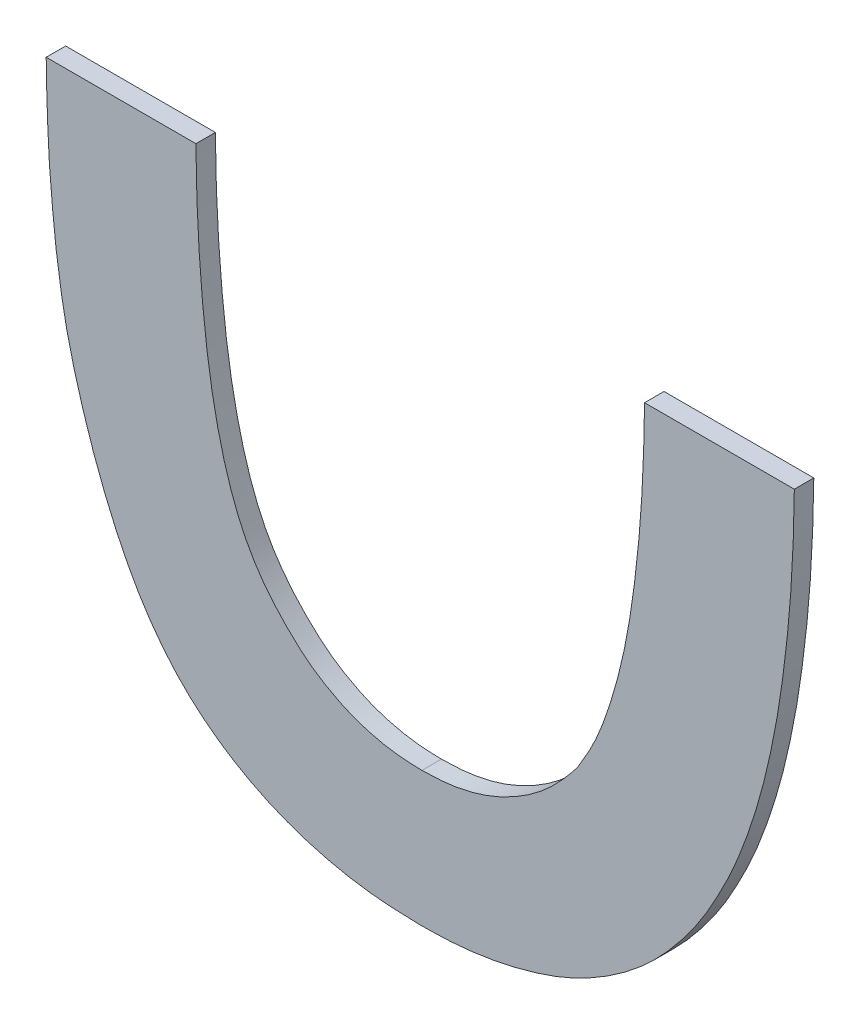
ISO-10303-21;
HEADER;
FILE_DESCRIPTION(('STEP AP214'),'2;1');
FILE_NAME('part.step','',(''),(''),'','','');
FILE_SCHEMA(('AUTOMOTIVE_DESIGN { 1 0 10303 214 1 1 1 1 }'));
ENDSEC;
DATA;
#1=APPLICATION_CONTEXT('core data for automotive mechanical design processes');
#2=APPLICATION_PROTOCOL_DEFINITION('international standard','automotive_design',2000,#1);
#3=PRODUCT_CONTEXT('',#1,'mechanical');
#4=PRODUCT('Part','Part','',(#3));
#5=PRODUCT_RELATED_PRODUCT_CATEGORY('part','',(#4));
#6=PRODUCT_DEFINITION_FORMATION('','',#4);
#7=PRODUCT_DEFINITION_CONTEXT('part definition',#1,'design');
#8=PRODUCT_DEFINITION('design','',#6,#7);
#9=PRODUCT_DEFINITION_SHAPE('','',#8);
#10=(LENGTH_UNIT() NAMED_UNIT(*) SI_UNIT(.MILLI.,.METRE.));
#11=(NAMED_UNIT(*) PLANE_ANGLE_UNIT() SI_UNIT($,.RADIAN.));
#12=(NAMED_UNIT(*) SI_UNIT($,.STERADIAN.) SOLID_ANGLE_UNIT());
#13=UNCERTAINTY_MEASURE_WITH_UNIT(LENGTH_MEASURE(1.E-05),#10,'distance_accuracy_value','');
#14=(GEOMETRIC_REPRESENTATION_CONTEXT(3) GLOBAL_UNCERTAINTY_ASSIGNED_CONTEXT((#13)) GLOBAL_UNIT_ASSIGNED_CONTEXT((#10,
#11,#12)) REPRESENTATION_CONTEXT('',''));
#15=CARTESIAN_POINT('',(0.,0.,0.));
#16=DIRECTION('',(0.,0.,1.));
#17=DIRECTION('',(1.,0.,0.));
#18=AXIS2_PLACEMENT_3D('',#15,#16,#17);
#19=CARTESIAN_POINT('',(0.0420673076912768,-11.5384615384615,0.5));
#20=CARTESIAN_POINT('',(0.240786414309637,-11.5333009100515,0.5));
#21=CARTESIAN_POINT('',(0.632635028196704,-11.5231248121228,0.5));
#22=CARTESIAN_POINT('',(1.20591159328327,-11.4241929709831,0.5));
#23=CARTESIAN_POINT('',(1.75167258286011,-11.2626905300285,0.5));
#24=CARTESIAN_POINT('',(2.26628595280769,-11.0297186532651,0.5));
#25=CARTESIAN_POINT('',(2.75484553812026,-10.7406941453217,0.5));
#26=CARTESIAN_POINT('',(3.21794418441694,-10.3891534082194,0.5));
#27=CARTESIAN_POINT('',(3.6444786071224,-9.96427856158394,0.5));
#28=CARTESIAN_POINT('',(3.90117934517971,-9.64595735773427,0.5));
#29=CARTESIAN_POINT('',(4.03245192307589,-9.48317307692307,0.5));
#30=B_SPLINE_CURVE_WITH_KNOTS('',3,(#19,#20,#21,#22,#23,#24,#25,#26,#27,#28,#29),.UNSPECIFIED.,
.F.,.F.,(4,1,1,1,1,1,1,1,4),(0.,0.127682869136432,0.251774256334202,0.372806201070959,
0.492736455392635,0.61401490129053,0.737160062335526,0.865587935381845,1.),.UNSPECIFIED.);
#31=DIRECTION('',(0.,0.,1.));
#32=VECTOR('',#31,1.);
#33=SURFACE_OF_LINEAR_EXTRUSION('',#30,#32);
#34=CARTESIAN_POINT('',(0.0420673076912768,-11.5384615384615,1.));
#35=CARTESIAN_POINT('',(0.240786414309637,-11.5333009100515,1.));
#36=CARTESIAN_POINT('',(0.632635028196704,-11.5231248121228,1.));
#37=CARTESIAN_POINT('',(1.20591159328327,-11.4241929709831,1.));
#38=CARTESIAN_POINT('',(1.75167258286011,-11.2626905300285,1.));
#39=CARTESIAN_POINT('',(2.26628595280769,-11.0297186532651,1.));
#40=CARTESIAN_POINT('',(2.75484553812026,-10.7406941453217,1.));
#41=CARTESIAN_POINT('',(3.21794418441694,-10.3891534082194,1.));
#42=CARTESIAN_POINT('',(3.6444786071224,-9.96427856158394,1.));
#43=CARTESIAN_POINT('',(3.90117934517971,-9.64595735773427,1.));
#44=CARTESIAN_POINT('',(4.03245192307589,-9.48317307692307,1.));
#45=B_SPLINE_CURVE_WITH_KNOTS('',3,(#34,#35,#36,#37,#38,#39,#40,#41,#42,#43,#44),.UNSPECIFIED.,
.F.,.F.,(4,1,1,1,1,1,1,1,4),(0.,0.127682869136432,0.251774256334202,0.372806201070959,
0.492736455392635,0.61401490129053,0.737160062335526,0.865587935381845,1.),.UNSPECIFIED.);
#46=CARTESIAN_POINT('',(0.0420673076912768,-11.5384615384615,1.));
#47=VERTEX_POINT('',#46);
#48=CARTESIAN_POINT('',(4.03245192307589,-9.48317307692307,1.));
#49=VERTEX_POINT('',#48);
#50=EDGE_CURVE('E151',#47,#49,#45,.T.);
#51=ORIENTED_EDGE('',*,*,#50,.T.);
#52=DIRECTION('',(0.,0.,1.));
#53=VECTOR('',#52,1.);
#54=CARTESIAN_POINT('',(4.03245192307589,-9.48317307692307,0.5));
#55=LINE('',#54,#53);
#56=CARTESIAN_POINT('',(4.03245192307589,-9.48317307692307,0.5));
#57=VERTEX_POINT('',#56);
#58=EDGE_CURVE('E116',#57,#49,#55,.T.);
#59=ORIENTED_EDGE('',*,*,#58,.F.);
#60=CARTESIAN_POINT('',(0.0420673076912768,-11.5384615384615,0.5));
#61=VERTEX_POINT('',#60);
#62=EDGE_CURVE('E154',#61,#57,#30,.T.);
#63=ORIENTED_EDGE('',*,*,#62,.F.);
#64=DIRECTION('',(0.,0.,1.));
#65=VECTOR('',#64,1.);
#66=CARTESIAN_POINT('',(0.0420673076912768,-11.5384615384615,0.5));
#67=LINE('',#66,#65);
#68=EDGE_CURVE('E122',#61,#47,#67,.T.);
#69=ORIENTED_EDGE('',*,*,#68,.T.);
#70=EDGE_LOOP('',(#51,#59,#63,#69));
#71=FACE_BOUND('',#70,.T.);
#72=ADVANCED_FACE('F39',(#71),#33,.F.);
#73=CARTESIAN_POINT('',(4.03245192307589,-9.48317307692307,0.5));
#74=CARTESIAN_POINT('',(4.1754080165598,-9.24417651933019,0.5));
#75=CARTESIAN_POINT('',(4.47730118684764,-8.7394661099924,0.5));
#76=CARTESIAN_POINT('',(4.81497627307182,-7.86223141434757,0.5));
#77=CARTESIAN_POINT('',(5.11442681079824,-6.85797061951387,0.5));
#78=CARTESIAN_POINT('',(5.3576397504729,-5.71429541304869,0.5));
#79=CARTESIAN_POINT('',(5.53760641636854,-4.43277644319568,0.5));
#80=CARTESIAN_POINT('',(5.67698959518765,-3.01545753498198,0.5));
#81=CARTESIAN_POINT('',(5.75009426710679,-1.45709346637208,0.5));
#82=CARTESIAN_POINT('',(5.76267594113006,-0.372661861328687,0.5));
#83=CARTESIAN_POINT('',(5.76923076922974,0.192307692307695,0.5));
#84=B_SPLINE_CURVE_WITH_KNOTS('',3,(#73,#74,#75,#76,#77,#78,#79,#80,#81,#82,#83),.UNSPECIFIED.,
.F.,.F.,(4,1,1,1,1,1,1,1,4),(0.,0.0838887288335159,0.177155332674352,0.282515708589513,
0.399993515725222,0.529487353690131,0.672799776764538,0.829534510787643,1.),.UNSPECIFIED.);
#85=DIRECTION('',(0.,0.,1.));
#86=VECTOR('',#85,1.);
#87=SURFACE_OF_LINEAR_EXTRUSION('',#84,#86);
#88=CARTESIAN_POINT('',(4.03245192307589,-9.48317307692307,1.));
#89=CARTESIAN_POINT('',(4.1754080165598,-9.24417651933019,1.));
#90=CARTESIAN_POINT('',(4.47730118684764,-8.7394661099924,1.));
#91=CARTESIAN_POINT('',(4.81497627307182,-7.86223141434757,1.));
#92=CARTESIAN_POINT('',(5.11442681079824,-6.85797061951387,1.));
#93=CARTESIAN_POINT('',(5.3576397504729,-5.71429541304869,1.));
#94=CARTESIAN_POINT('',(5.53760641636854,-4.43277644319568,1.));
#95=CARTESIAN_POINT('',(5.67698959518765,-3.01545753498198,1.));
#96=CARTESIAN_POINT('',(5.75009426710679,-1.45709346637208,1.));
#97=CARTESIAN_POINT('',(5.76267594113006,-0.372661861328687,1.));
#98=CARTESIAN_POINT('',(5.76923076922974,0.192307692307695,1.));
#99=B_SPLINE_CURVE_WITH_KNOTS('',3,(#88,#89,#90,#91,#92,#93,#94,#95,#96,#97,#98),.UNSPECIFIED.,
.F.,.F.,(4,1,1,1,1,1,1,1,4),(0.,0.0838887288335159,0.177155332674352,0.282515708589513,
0.399993515725222,0.529487353690131,0.672799776764538,0.829534510787643,1.),.UNSPECIFIED.);
#100=CARTESIAN_POINT('',(5.76049072544374,-0.5,1.));
#101=VERTEX_POINT('',#100);
#102=EDGE_CURVE('E111',#49,#101,#99,.T.);
#103=ORIENTED_EDGE('',*,*,#102,.T.);
#104=DIRECTION('',(0.,0.,1.));
#105=VECTOR('',#104,1.);
#106=CARTESIAN_POINT('',(5.76049072544374,-0.500000000007296,0.5));
#107=LINE('',#106,#105);
#108=CARTESIAN_POINT('',(5.76049072544374,-0.500000000007295,0.5));
#109=VERTEX_POINT('',#108);
#110=EDGE_CURVE('E99',#101,#109,#107,.F.);
#111=ORIENTED_EDGE('',*,*,#110,.T.);
#112=EDGE_CURVE('E159',#57,#109,#84,.T.);
#113=ORIENTED_EDGE('',*,*,#112,.F.);
#114=ORIENTED_EDGE('',*,*,#58,.T.);
#115=EDGE_LOOP('',(#103,#111,#113,#114));
#116=FACE_BOUND('',#115,.T.);
#117=ADVANCED_FACE('F194',(#116),#87,.F.);
#118=CARTESIAN_POINT('',(-5.7692307692318,0.192307692307695,0.5));
#119=CARTESIAN_POINT('',(-5.76558857571219,-0.372698327858928,0.5));
#120=CARTESIAN_POINT('',(-5.75861027075951,-1.45522848107276,0.5));
#121=CARTESIAN_POINT('',(-5.6797410109643,-3.0028294072483,0.5));
#122=CARTESIAN_POINT('',(-5.55614874602414,-4.40251031723917,0.5));
#123=CARTESIAN_POINT('',(-5.3870850512294,-5.65555059461358,0.500000000000001));
#124=CARTESIAN_POINT('',(-5.1624280064753,-6.76062476085278,0.5));
#125=CARTESIAN_POINT('',(-4.8898632567801,-7.71997665316074,0.5));
#126=CARTESIAN_POINT('',(-4.56532616473994,-8.53189519306031,0.5));
#127=CARTESIAN_POINT('',(-4.17863786806905,-9.20350199653105,0.5));
#128=CARTESIAN_POINT('',(-3.74989033760966,-9.75789121259897,0.5));
#129=CARTESIAN_POINT('',(-3.29435705418506,-10.2284050562378,0.5));
#130=CARTESIAN_POINT('',(-2.82085358528759,-10.6407321154234,0.5));
#131=CARTESIAN_POINT('',(-2.30232113639501,-10.9635927045618,0.5));
#132=CARTESIAN_POINT('',(-1.7608033270197,-11.2283849588181,0.5));
#133=CARTESIAN_POINT('',(-1.18469172397509,-11.405645498329,0.5));
#134=CARTESIAN_POINT('',(-0.581425152398743,-11.5194099547976,0.5));
#135=CARTESIAN_POINT('',(-0.168803276968812,-11.5320181268037,0.5));
#136=CARTESIAN_POINT('',(0.0420673076912768,-11.5384615384615,0.5));
#137=B_SPLINE_CURVE_WITH_KNOTS('',3,(#118,#119,#120,#121,#122,#123,#124,#125,#126,#127,#128,
#129,#130,#131,#132,#133,#134,#135,#136),.UNSPECIFIED.,.F.,.F.,(4,1,1,1,1,1,1,1,1,1,1,1,1,1,1,1,
4),(0.,0.115634102699545,0.221550564850914,0.317061488513159,0.403168210156165,
0.480201863351944,0.547672913751764,0.607061943921203,0.658680728530501,0.705753234737995,
0.750119517661033,0.792590568079875,0.833879488992673,0.874775679647928,0.915622513522867,
0.956878849704605,1.),.UNSPECIFIED.);
#138=DIRECTION('',(0.,0.,1.));
#139=VECTOR('',#138,1.);
#140=SURFACE_OF_LINEAR_EXTRUSION('',#137,#139);
#141=CARTESIAN_POINT('',(-5.76387434982146,-0.5,0.5));
#142=VERTEX_POINT('',#141);
#143=EDGE_CURVE('E181',#142,#61,#137,.T.);
#144=ORIENTED_EDGE('',*,*,#143,.F.);
#145=DIRECTION('',(0.,0.,1.));
#146=VECTOR('',#145,1.);
#147=CARTESIAN_POINT('',(-5.76387434982146,-0.5,0.5));
#148=LINE('',#147,#146);
#149=CARTESIAN_POINT('',(-5.76387434982146,-0.49999999999995,1.));
#150=VERTEX_POINT('',#149);
#151=EDGE_CURVE('E11',#142,#150,#148,.T.);
#152=ORIENTED_EDGE('',*,*,#151,.T.);
#153=CARTESIAN_POINT('',(-5.7692307692318,0.192307692307695,1.));
#154=CARTESIAN_POINT('',(-5.76558857571219,-0.372698327858928,1.));
#155=CARTESIAN_POINT('',(-5.75861027075951,-1.45522848107276,1.));
#156=CARTESIAN_POINT('',(-5.6797410109643,-3.0028294072483,1.));
#157=CARTESIAN_POINT('',(-5.55614874602414,-4.40251031723917,1.));
#158=CARTESIAN_POINT('',(-5.3870850512294,-5.65555059461358,1.));
#159=CARTESIAN_POINT('',(-5.1624280064753,-6.76062476085278,1.));
#160=CARTESIAN_POINT('',(-4.8898632567801,-7.71997665316074,1.));
#161=CARTESIAN_POINT('',(-4.56532616473994,-8.53189519306031,1.));
#162=CARTESIAN_POINT('',(-4.17863786806905,-9.20350199653105,1.));
#163=CARTESIAN_POINT('',(-3.74989033760966,-9.75789121259897,1.));
#164=CARTESIAN_POINT('',(-3.29435705418506,-10.2284050562378,1.));
#165=CARTESIAN_POINT('',(-2.82085358528759,-10.6407321154234,1.));
#166=CARTESIAN_POINT('',(-2.30232113639501,-10.9635927045618,1.));
#167=CARTESIAN_POINT('',(-1.7608033270197,-11.2283849588181,1.));
#168=CARTESIAN_POINT('',(-1.18469172397509,-11.405645498329,1.));
#169=CARTESIAN_POINT('',(-0.581425152398743,-11.5194099547976,1.));
#170=CARTESIAN_POINT('',(-0.168803276968812,-11.5320181268037,1.));
#171=CARTESIAN_POINT('',(0.0420673076912768,-11.5384615384615,1.));
#172=B_SPLINE_CURVE_WITH_KNOTS('',3,(#153,#154,#155,#156,#157,#158,#159,#160,#161,#162,#163,
#164,#165,#166,#167,#168,#169,#170,#171),.UNSPECIFIED.,.F.,.F.,(4,1,1,1,1,1,1,1,1,1,1,1,1,1,1,1,
4),(0.,0.115634102699545,0.221550564850914,0.317061488513159,0.403168210156165,
0.480201863351944,0.547672913751764,0.607061943921203,0.658680728530501,0.705753234737995,
0.750119517661033,0.792590568079875,0.833879488992673,0.874775679647928,0.915622513522867,
0.956878849704605,1.),.UNSPECIFIED.);
#173=EDGE_CURVE('E158',#150,#47,#172,.T.);
#174=ORIENTED_EDGE('',*,*,#173,.T.);
#175=ORIENTED_EDGE('',*,*,#68,.F.);
#176=EDGE_LOOP('',(#144,#152,#174,#175));
#177=FACE_BOUND('',#176,.T.);
#178=ADVANCED_FACE('F193',(#177),#140,.F.);
#179=CARTESIAN_POINT('',(9.07665296559267,6.58886102964351,0.5));
#180=DIRECTION('',(0.,0.,1.));
#181=DIRECTION('',(1.,0.,0.));
#182=AXIS2_PLACEMENT_3D('',#179,#180,#181);
#183=PLANE('',#182);
#184=CARTESIAN_POINT('',(-1.0321604682062E-12,-15.,0.5));
#185=CARTESIAN_POINT('',(-0.385328520998497,-14.988850103715,0.5));
#186=CARTESIAN_POINT('',(-1.14232185642434,-14.9669456852291,0.5));
#187=CARTESIAN_POINT('',(-2.24613557420914,-14.7830432928222,0.5));
#188=CARTESIAN_POINT('',(-3.28961869038478,-14.4819568472798,0.5));
#189=CARTESIAN_POINT('',(-4.26485879679997,-14.062945452452,0.5));
#190=CARTESIAN_POINT('',(-5.15901153605289,-13.5261726894685,0.5));
#191=CARTESIAN_POINT('',(-5.96088292762468,-12.8811613353897,0.5));
#192=CARTESIAN_POINT('',(-6.65110570728021,-12.1182972704143,0.5));
#193=CARTESIAN_POINT('',(-7.24331810238721,-11.2531672185744,0.5));
#194=CARTESIAN_POINT('',(-7.75158876574181,-10.2860345346414,0.5));
#195=CARTESIAN_POINT('',(-8.20612493559977,-9.22519326738976,0.5));
#196=CARTESIAN_POINT('',(-8.61369789754082,-8.06638132921851,0.5));
#197=CARTESIAN_POINT('',(-8.91201397491909,-7.03200678136618,0.5));
#198=CARTESIAN_POINT('',(-9.12116211313522,-6.13758870617562,0.5));
#199=CARTESIAN_POINT('',(-9.24849707492484,-5.39850268489454,0.5));
#200=CARTESIAN_POINT('',(-9.36606423862533,-4.60347314741359,0.5));
#201=CARTESIAN_POINT('',(-9.4493974289616,-3.75059601253612,0.5));
#202=CARTESIAN_POINT('',(-9.53419573058855,-2.84385750290076,0.5));
#203=CARTESIAN_POINT('',(-9.57606168643943,-1.87930379855171,0.5));
#204=CARTESIAN_POINT('',(-9.60801158413832,-0.857589898346016,0.5));
#205=CARTESIAN_POINT('',(-9.61288086472932,-0.156281197168638,0.5));
#206=CARTESIAN_POINT('',(-9.61538461538565,0.204326923076927,0.5));
#207=B_SPLINE_CURVE_WITH_KNOTS('',3,(#184,#185,#186,#187,#188,#189,#190,#191,#192,#193,#194,
#195,#196,#197,#198,#199,#200,#201,#202,#203,#204,#205,#206),.UNSPECIFIED.,.F.,.F.,(4,1,1,1,1,1,
1,1,1,1,1,1,1,1,1,1,1,1,1,1,4),(0.,0.0567196362764618,0.111428000548503,0.164271091180386,
0.216334326401902,0.267283152573198,0.317412253072944,0.367322113831877,0.418222231336741,
0.47141170856998,0.527968458610384,0.588058873991604,0.652207488831434,0.686415227024687,
0.723277926551376,0.762621236219799,0.804746430743811,0.849458467539935,0.896719818281156,
0.946894039492556,1.),.UNSPECIFIED.);
#208=CARTESIAN_POINT('',(-1.0321604682062E-12,-15.,0.5));
#209=VERTEX_POINT('',#208);
#210=CARTESIAN_POINT('',(-9.60925002230786,-0.5,0.500000000000143));
#211=VERTEX_POINT('',#210);
#212=EDGE_CURVE('E130',#209,#211,#207,.T.);
#213=ORIENTED_EDGE('',*,*,#212,.T.);
#214=DIRECTION('',(1.,0.,0.));
#215=VECTOR('',#214,1.);
#216=CARTESIAN_POINT('',(9.07665296559267,-0.5,0.500000000000026));
#217=LINE('',#216,#215);
#218=EDGE_CURVE('E103',#211,#142,#217,.T.);
#219=ORIENTED_EDGE('',*,*,#218,.T.);
#220=ORIENTED_EDGE('',*,*,#143,.T.);
#221=ORIENTED_EDGE('',*,*,#62,.T.);
#222=ORIENTED_EDGE('',*,*,#112,.T.);
#223=CARTESIAN_POINT('',(9.6079655425923,-0.5,0.500000000000023));
#224=VERTEX_POINT('',#223);
#225=EDGE_CURVE('E54',#109,#224,#217,.T.);
#226=ORIENTED_EDGE('',*,*,#225,.T.);
#227=CARTESIAN_POINT('',(9.61538461538358,0.204326923076927,0.5));
#228=CARTESIAN_POINT('',(9.61150856420301,-0.224400408885449,0.5));
#229=CARTESIAN_POINT('',(9.6039170121901,-1.06409671017859,0.5));
#230=CARTESIAN_POINT('',(9.55685652563403,-2.29272670654069,0.5));
#231=CARTESIAN_POINT('',(9.47461547561735,-3.45949291643717,0.5));
#232=CARTESIAN_POINT('',(9.35210749707355,-4.56343997614587,0.5));
#233=CARTESIAN_POINT('',(9.20593400687098,-5.60880875241869,0.5));
#234=CARTESIAN_POINT('',(9.01867958059482,-6.59281334855436,0.5));
#235=CARTESIAN_POINT('',(8.80499174694216,-7.51655917025234,0.5));
#236=CARTESIAN_POINT('',(8.55170039414064,-8.37654030282214,0.5));
#237=CARTESIAN_POINT('',(8.26871771224848,-9.18167947361874,0.5));
#238=CARTESIAN_POINT('',(7.95304036268916,-9.93424258658525,0.5));
#239=CARTESIAN_POINT('',(7.59356046872461,-10.6303856047183,0.5));
#240=CARTESIAN_POINT('',(7.22062837798749,-11.286680900075,0.5));
#241=CARTESIAN_POINT('',(6.79632431314302,-11.8779466771417,0.5));
#242=CARTESIAN_POINT('',(6.35044991215261,-12.4256583220102,0.5));
#243=CARTESIAN_POINT('',(5.8694280023987,-12.9203024301643,0.5));
#244=CARTESIAN_POINT('',(5.35119562867232,-13.3594863538908,0.5));
#245=CARTESIAN_POINT('',(4.79977019911976,-13.7472163929278,0.5));
#246=CARTESIAN_POINT('',(4.21688791022913,-14.0837251251013,0.5));
#247=CARTESIAN_POINT('',(3.59834687193225,-14.3703498661873,0.5));
#248=CARTESIAN_POINT('',(2.94240242380412,-14.5949011127614,0.5));
#249=CARTESIAN_POINT('',(2.25543922046263,-14.7756348606693,0.5));
#250=CARTESIAN_POINT('',(1.53473885507364,-14.9092400701844,0.5));
#251=CARTESIAN_POINT('',(0.77901648706274,-14.9878482843182,0.5));
#252=CARTESIAN_POINT('',(0.262605694315263,-14.9959036685529,0.5));
#253=CARTESIAN_POINT('',(-1.0321604682062E-12,-15.,0.5));
#254=B_SPLINE_CURVE_WITH_KNOTS('',3,(#227,#228,#229,#230,#231,#232,#233,#234,#235,#236,#237,
#238,#239,#240,#241,#242,#243,#244,#245,#246,#247,#248,#249,#250,#251,#252,#253),.UNSPECIFIED.,
.F.,.F.,(4,1,1,1,1,1,1,1,1,1,1,1,1,1,1,1,1,1,1,1,1,1,1,1,4),(0.,0.063106207716051,
0.12359848616429,0.180950053279516,0.235230700301158,0.287063170407353,0.336276507045082,
0.382622059981955,0.426568049437359,0.468161059594326,0.508194731945807,0.546568450205374,
0.583435365644369,0.619186438381892,0.653542356066901,0.687321508610388,0.720583215672022,
0.753386953654324,0.786412573060312,0.819527578958376,0.853564420101512,0.888322881312637,
0.924005796431376,0.961355357261267,1.),.UNSPECIFIED.);
#255=EDGE_CURVE('E115',#224,#209,#254,.T.);
#256=ORIENTED_EDGE('',*,*,#255,.T.);
#257=EDGE_LOOP('',(#213,#219,#220,#221,#222,#226,#256));
#258=FACE_BOUND('',#257,.T.);
#259=ADVANCED_FACE('F200',(#258),#183,.F.);
#260=DIRECTION('',(0.,0.,1.));
#261=VECTOR('',#260,1.);
#262=SURFACE_OF_LINEAR_EXTRUSION('',#207,#261);
#263=CARTESIAN_POINT('',(-1.0321604682062E-12,-15.,1.));
#264=CARTESIAN_POINT('',(-0.385328520998497,-14.988850103715,1.));
#265=CARTESIAN_POINT('',(-1.14232185642434,-14.9669456852291,1.));
#266=CARTESIAN_POINT('',(-2.24613557420914,-14.7830432928222,1.));
#267=CARTESIAN_POINT('',(-3.28961869038478,-14.4819568472798,1.));
#268=CARTESIAN_POINT('',(-4.26485879679997,-14.062945452452,1.));
#269=CARTESIAN_POINT('',(-5.15901153605289,-13.5261726894685,1.));
#270=CARTESIAN_POINT('',(-5.96088292762468,-12.8811613353897,1.));
#271=CARTESIAN_POINT('',(-6.65110570728021,-12.1182972704143,1.));
#272=CARTESIAN_POINT('',(-7.24331810238721,-11.2531672185744,1.));
#273=CARTESIAN_POINT('',(-7.75158876574181,-10.2860345346414,1.));
#274=CARTESIAN_POINT('',(-8.20612493559977,-9.22519326738976,1.));
#275=CARTESIAN_POINT('',(-8.61369789754082,-8.06638132921851,1.));
#276=CARTESIAN_POINT('',(-8.91201397491909,-7.03200678136618,1.));
#277=CARTESIAN_POINT('',(-9.12116211313522,-6.13758870617562,1.));
#278=CARTESIAN_POINT('',(-9.24849707492484,-5.39850268489454,1.));
#279=CARTESIAN_POINT('',(-9.36606423862533,-4.60347314741359,1.));
#280=CARTESIAN_POINT('',(-9.4493974289616,-3.75059601253612,1.));
#281=CARTESIAN_POINT('',(-9.53419573058855,-2.84385750290076,1.));
#282=CARTESIAN_POINT('',(-9.57606168643943,-1.87930379855171,1.));
#283=CARTESIAN_POINT('',(-9.60801158413832,-0.857589898346016,1.));
#284=CARTESIAN_POINT('',(-9.61288086472932,-0.156281197168638,1.));
#285=CARTESIAN_POINT('',(-9.61538461538565,0.204326923076927,1.));
#286=B_SPLINE_CURVE_WITH_KNOTS('',3,(#263,#264,#265,#266,#267,#268,#269,#270,#271,#272,#273,
#274,#275,#276,#277,#278,#279,#280,#281,#282,#283,#284,#285),.UNSPECIFIED.,.F.,.F.,(4,1,1,1,1,1,
1,1,1,1,1,1,1,1,1,1,1,1,1,1,4),(0.,0.0567196362764618,0.111428000548503,0.164271091180386,
0.216334326401902,0.267283152573198,0.317412253072944,0.367322113831877,0.418222231336741,
0.47141170856998,0.527968458610384,0.588058873991604,0.652207488831434,0.686415227024687,
0.723277926551376,0.762621236219799,0.804746430743811,0.849458467539935,0.896719818281156,
0.946894039492556,1.),.UNSPECIFIED.);
#287=CARTESIAN_POINT('',(-1.0321604682062E-12,-15.,1.));
#288=VERTEX_POINT('',#287);
#289=CARTESIAN_POINT('',(-9.60925002230786,-0.5,1.));
#290=VERTEX_POINT('',#289);
#291=EDGE_CURVE('E120',#288,#290,#286,.T.);
#292=ORIENTED_EDGE('',*,*,#291,.T.);
#293=DIRECTION('',(0.,0.,1.));
#294=VECTOR('',#293,1.);
#295=CARTESIAN_POINT('',(-9.60925002230786,-0.499999999999999,0.5));
#296=LINE('',#295,#294);
#297=EDGE_CURVE('E211',#290,#211,#296,.F.);
#298=ORIENTED_EDGE('',*,*,#297,.T.);
#299=ORIENTED_EDGE('',*,*,#212,.F.);
#300=DIRECTION('',(0.,0.,1.));
#301=VECTOR('',#300,1.);
#302=CARTESIAN_POINT('',(-1.0321604682062E-12,-15.,0.5));
#303=LINE('',#302,#301);
#304=EDGE_CURVE('E48',#209,#288,#303,.T.);
#305=ORIENTED_EDGE('',*,*,#304,.T.);
#306=EDGE_LOOP('',(#292,#298,#299,#305));
#307=FACE_BOUND('',#306,.T.);
#308=ADVANCED_FACE('F216',(#307),#262,.F.);
#309=DIRECTION('',(0.,0.,1.));
#310=VECTOR('',#309,1.);
#311=SURFACE_OF_LINEAR_EXTRUSION('',#254,#310);
#312=ORIENTED_EDGE('',*,*,#255,.F.);
#313=DIRECTION('',(0.,0.,1.));
#314=VECTOR('',#313,1.);
#315=CARTESIAN_POINT('',(9.60796554259231,-0.5,0.5));
#316=LINE('',#315,#314);
#317=CARTESIAN_POINT('',(9.6079655425923,-0.5,1.));
#318=VERTEX_POINT('',#317);
#319=EDGE_CURVE('E98',#224,#318,#316,.T.);
#320=ORIENTED_EDGE('',*,*,#319,.T.);
#321=CARTESIAN_POINT('',(9.61538461538358,0.204326923076927,1.));
#322=CARTESIAN_POINT('',(9.61150856420301,-0.224400408885449,1.));
#323=CARTESIAN_POINT('',(9.6039170121901,-1.06409671017859,1.));
#324=CARTESIAN_POINT('',(9.55685652563403,-2.29272670654069,1.));
#325=CARTESIAN_POINT('',(9.47461547561735,-3.45949291643717,1.));
#326=CARTESIAN_POINT('',(9.35210749707355,-4.56343997614587,1.));
#327=CARTESIAN_POINT('',(9.20593400687098,-5.60880875241869,1.));
#328=CARTESIAN_POINT('',(9.01867958059482,-6.59281334855436,1.));
#329=CARTESIAN_POINT('',(8.80499174694216,-7.51655917025234,1.));
#330=CARTESIAN_POINT('',(8.55170039414064,-8.37654030282214,1.));
#331=CARTESIAN_POINT('',(8.26871771224848,-9.18167947361874,1.));
#332=CARTESIAN_POINT('',(7.95304036268916,-9.93424258658525,1.));
#333=CARTESIAN_POINT('',(7.59356046872461,-10.6303856047183,1.));
#334=CARTESIAN_POINT('',(7.22062837798749,-11.286680900075,1.));
#335=CARTESIAN_POINT('',(6.79632431314302,-11.8779466771417,1.));
#336=CARTESIAN_POINT('',(6.35044991215261,-12.4256583220102,1.));
#337=CARTESIAN_POINT('',(5.8694280023987,-12.9203024301643,1.));
#338=CARTESIAN_POINT('',(5.35119562867232,-13.3594863538908,1.));
#339=CARTESIAN_POINT('',(4.79977019911976,-13.7472163929278,1.));
#340=CARTESIAN_POINT('',(4.21688791022913,-14.0837251251013,1.));
#341=CARTESIAN_POINT('',(3.59834687193225,-14.3703498661873,1.));
#342=CARTESIAN_POINT('',(2.94240242380412,-14.5949011127614,1.));
#343=CARTESIAN_POINT('',(2.25543922046263,-14.7756348606693,1.));
#344=CARTESIAN_POINT('',(1.53473885507364,-14.9092400701844,1.));
#345=CARTESIAN_POINT('',(0.77901648706274,-14.9878482843182,1.));
#346=CARTESIAN_POINT('',(0.262605694315263,-14.9959036685529,1.));
#347=CARTESIAN_POINT('',(-1.0321604682062E-12,-15.,1.));
#348=B_SPLINE_CURVE_WITH_KNOTS('',3,(#321,#322,#323,#324,#325,#326,#327,#328,#329,#330,#331,
#332,#333,#334,#335,#336,#337,#338,#339,#340,#341,#342,#343,#344,#345,#346,#347),.UNSPECIFIED.,
.F.,.F.,(4,1,1,1,1,1,1,1,1,1,1,1,1,1,1,1,1,1,1,1,1,1,1,1,4),(0.,0.063106207716051,
0.12359848616429,0.180950053279516,0.235230700301158,0.287063170407353,0.336276507045082,
0.382622059981955,0.426568049437359,0.468161059594326,0.508194731945807,0.546568450205374,
0.583435365644369,0.619186438381892,0.653542356066901,0.687321508610388,0.720583215672022,
0.753386953654324,0.786412573060312,0.819527578958376,0.853564420101512,0.888322881312637,
0.924005796431376,0.961355357261267,1.),.UNSPECIFIED.);
#349=EDGE_CURVE('E108',#318,#288,#348,.T.);
#350=ORIENTED_EDGE('',*,*,#349,.T.);
#351=ORIENTED_EDGE('',*,*,#304,.F.);
#352=EDGE_LOOP('',(#312,#320,#350,#351));
#353=FACE_BOUND('',#352,.T.);
#354=ADVANCED_FACE('F41',(#353),#311,.F.);
#355=CARTESIAN_POINT('',(9.07665296559267,6.58886102964351,1.));
#356=DIRECTION('',(0.,0.,1.));
#357=DIRECTION('',(1.,0.,0.));
#358=AXIS2_PLACEMENT_3D('',#355,#356,#357);
#359=PLANE('',#358);
#360=ORIENTED_EDGE('',*,*,#349,.F.);
#361=DIRECTION('',(-1.,0.,0.));
#362=VECTOR('',#361,1.);
#363=CARTESIAN_POINT('',(-17.,-0.5,1.));
#364=LINE('',#363,#362);
#365=EDGE_CURVE('E96',#318,#101,#364,.T.);
#366=ORIENTED_EDGE('',*,*,#365,.T.);
#367=ORIENTED_EDGE('',*,*,#102,.F.);
#368=ORIENTED_EDGE('',*,*,#50,.F.);
#369=ORIENTED_EDGE('',*,*,#173,.F.);
#370=EDGE_CURVE('E65',#150,#290,#364,.T.);
#371=ORIENTED_EDGE('',*,*,#370,.T.);
#372=ORIENTED_EDGE('',*,*,#291,.F.);
#373=EDGE_LOOP('',(#360,#366,#367,#368,#369,#371,#372));
#374=FACE_BOUND('',#373,.T.);
#375=ADVANCED_FACE('F117',(#374),#359,.T.);
#376=CARTESIAN_POINT('',(-17.,-0.5,1.));
#377=DIRECTION('',(0.,-1.,0.));
#378=DIRECTION('',(0.,0.,-1.));
#379=AXIS2_PLACEMENT_3D('',#376,#377,#378);
#380=PLANE('',#379);
#381=ORIENTED_EDGE('',*,*,#370,.F.);
#382=ORIENTED_EDGE('',*,*,#151,.F.);
#383=ORIENTED_EDGE('',*,*,#218,.F.);
#384=ORIENTED_EDGE('',*,*,#297,.F.);
#385=EDGE_LOOP('',(#381,#382,#383,#384));
#386=FACE_BOUND('',#385,.T.);
#387=ADVANCED_FACE('F219',(#386),#380,.F.);
#388=ORIENTED_EDGE('',*,*,#225,.F.);
#389=ORIENTED_EDGE('',*,*,#110,.F.);
#390=ORIENTED_EDGE('',*,*,#365,.F.);
#391=ORIENTED_EDGE('',*,*,#319,.F.);
#392=EDGE_LOOP('',(#388,#389,#390,#391));
#393=FACE_BOUND('',#392,.T.);
#394=ADVANCED_FACE('F97',(#393),#380,.F.);
#395=CLOSED_SHELL('',(#72,#117,#178,#259,#308,#354,#375,#387,#394));
#396=MANIFOLD_SOLID_BREP('B2',#395);
#397=ADVANCED_BREP_SHAPE_REPRESENTATION('',(#18,#396),#14);
#398=SHAPE_DEFINITION_REPRESENTATION(#9,#397);
ENDSEC;
END-ISO-10303-21;
